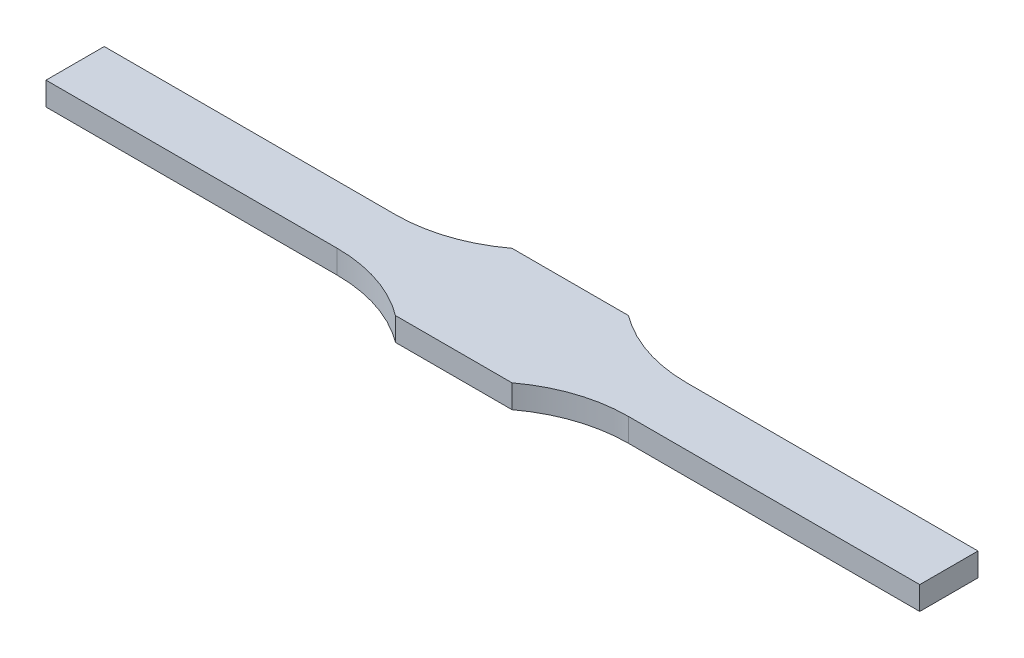
ISO-10303-21;
HEADER;
FILE_DESCRIPTION(('STEP AP214'),'2;1');
FILE_NAME('part.step','',(''),(''),'','','');
FILE_SCHEMA(('AUTOMOTIVE_DESIGN { 1 0 10303 214 1 1 1 1 }'));
ENDSEC;
DATA;
#1=APPLICATION_CONTEXT('core data for automotive mechanical design processes');
#2=APPLICATION_PROTOCOL_DEFINITION('international standard','automotive_design',2000,#1);
#3=PRODUCT_CONTEXT('',#1,'mechanical');
#4=PRODUCT('Part','Part','',(#3));
#5=PRODUCT_RELATED_PRODUCT_CATEGORY('part','',(#4));
#6=PRODUCT_DEFINITION_FORMATION('','',#4);
#7=PRODUCT_DEFINITION_CONTEXT('part definition',#1,'design');
#8=PRODUCT_DEFINITION('design','',#6,#7);
#9=PRODUCT_DEFINITION_SHAPE('','',#8);
#10=(LENGTH_UNIT() NAMED_UNIT(*) SI_UNIT(.MILLI.,.METRE.));
#11=(NAMED_UNIT(*) PLANE_ANGLE_UNIT() SI_UNIT($,.RADIAN.));
#12=(NAMED_UNIT(*) SI_UNIT($,.STERADIAN.) SOLID_ANGLE_UNIT());
#13=UNCERTAINTY_MEASURE_WITH_UNIT(LENGTH_MEASURE(1.E-05),#10,'distance_accuracy_value','');
#14=(GEOMETRIC_REPRESENTATION_CONTEXT(3) GLOBAL_UNCERTAINTY_ASSIGNED_CONTEXT((#13)) GLOBAL_UNIT_ASSIGNED_CONTEXT((#10,
#11,#12)) REPRESENTATION_CONTEXT('',''));
#15=CARTESIAN_POINT('',(0.,0.,0.));
#16=DIRECTION('',(0.,0.,1.));
#17=DIRECTION('',(1.,0.,0.));
#18=AXIS2_PLACEMENT_3D('',#15,#16,#17);
#19=CARTESIAN_POINT('',(25.,2.,-30.));
#20=DIRECTION('',(0.,-1.,0.));
#21=DIRECTION('',(0.,0.,-1.));
#22=AXIS2_PLACEMENT_3D('',#19,#20,#21);
#23=CYLINDRICAL_SURFACE('',#22,25.0000000000001);
#24=CARTESIAN_POINT('',(25.,-2.,-30.));
#25=DIRECTION('',(0.,-1.,0.));
#26=DIRECTION('',(0.,0.,-1.));
#27=AXIS2_PLACEMENT_3D('',#24,#25,#26);
#28=CIRCLE('',#27,25.0000000000001);
#29=CARTESIAN_POINT('',(25.,-2.,-4.99999999999989));
#30=VERTEX_POINT('',#29);
#31=CARTESIAN_POINT('',(9.99999999999982,-2.,-10.));
#32=VERTEX_POINT('',#31);
#33=EDGE_CURVE('E182',#30,#32,#28,.T.);
#34=ORIENTED_EDGE('',*,*,#33,.T.);
#35=DIRECTION('',(0.,-1.,0.));
#36=VECTOR('',#35,1.);
#37=CARTESIAN_POINT('',(9.99999999999982,2.,-10.));
#38=LINE('',#37,#36);
#39=CARTESIAN_POINT('',(9.99999999999982,2.,-10.));
#40=VERTEX_POINT('',#39);
#41=EDGE_CURVE('E11',#40,#32,#38,.T.);
#42=ORIENTED_EDGE('',*,*,#41,.F.);
#43=CARTESIAN_POINT('',(25.,2.,-30.));
#44=DIRECTION('',(0.,-1.,0.));
#45=DIRECTION('',(0.,0.,-1.));
#46=AXIS2_PLACEMENT_3D('',#43,#44,#45);
#47=CIRCLE('',#46,25.0000000000001);
#48=CARTESIAN_POINT('',(25.,2.,-4.99999999999989));
#49=VERTEX_POINT('',#48);
#50=EDGE_CURVE('E184',#49,#40,#47,.T.);
#51=ORIENTED_EDGE('',*,*,#50,.F.);
#52=DIRECTION('',(0.,-1.,0.));
#53=VECTOR('',#52,1.);
#54=CARTESIAN_POINT('',(25.,2.,-4.99999999999989));
#55=LINE('',#54,#53);
#56=EDGE_CURVE('E195',#49,#30,#55,.T.);
#57=ORIENTED_EDGE('',*,*,#56,.T.);
#58=EDGE_LOOP('',(#34,#42,#51,#57));
#59=FACE_BOUND('',#58,.T.);
#60=ADVANCED_FACE('F39',(#59),#23,.F.);
#61=CARTESIAN_POINT('',(0.,2.,-10.));
#62=DIRECTION('',(0.,0.,1.));
#63=DIRECTION('',(1.,0.,0.));
#64=AXIS2_PLACEMENT_3D('',#61,#62,#63);
#65=PLANE('',#64);
#66=DIRECTION('',(-1.,0.,0.));
#67=VECTOR('',#66,1.);
#68=CARTESIAN_POINT('',(0.,-2.,-10.));
#69=LINE('',#68,#67);
#70=CARTESIAN_POINT('',(-9.99999999999982,-2.00000000000007,-10.));
#71=VERTEX_POINT('',#70);
#72=EDGE_CURVE('E198',#32,#71,#69,.T.);
#73=ORIENTED_EDGE('',*,*,#72,.T.);
#74=DIRECTION('',(0.,-1.,0.));
#75=VECTOR('',#74,1.);
#76=CARTESIAN_POINT('',(-9.99999999999984,1.99999999999993,-10.));
#77=LINE('',#76,#75);
#78=CARTESIAN_POINT('',(-9.99999999999984,1.99999999999993,-10.));
#79=VERTEX_POINT('',#78);
#80=EDGE_CURVE('E164',#79,#71,#77,.T.);
#81=ORIENTED_EDGE('',*,*,#80,.F.);
#82=DIRECTION('',(-1.,0.,0.));
#83=VECTOR('',#82,1.);
#84=CARTESIAN_POINT('',(0.,2.,-10.));
#85=LINE('',#84,#83);
#86=EDGE_CURVE('E91',#40,#79,#85,.T.);
#87=ORIENTED_EDGE('',*,*,#86,.F.);
#88=ORIENTED_EDGE('',*,*,#41,.T.);
#89=EDGE_LOOP('',(#73,#81,#87,#88));
#90=FACE_BOUND('',#89,.T.);
#91=ADVANCED_FACE('F251',(#90),#65,.F.);
#92=CARTESIAN_POINT('',(0.,2.,10.));
#93=DIRECTION('',(0.,0.,-1.));
#94=DIRECTION('',(-1.,0.,0.));
#95=AXIS2_PLACEMENT_3D('',#92,#93,#94);
#96=PLANE('',#95);
#97=DIRECTION('',(1.,0.,0.));
#98=VECTOR('',#97,1.);
#99=CARTESIAN_POINT('',(0.,-2.,10.));
#100=LINE('',#99,#98);
#101=CARTESIAN_POINT('',(-9.99999999999981,-2.00000000000007,10.));
#102=VERTEX_POINT('',#101);
#103=CARTESIAN_POINT('',(9.99999999999983,-2.,10.));
#104=VERTEX_POINT('',#103);
#105=EDGE_CURVE('E200',#102,#104,#100,.T.);
#106=ORIENTED_EDGE('',*,*,#105,.T.);
#107=DIRECTION('',(0.,-1.,0.));
#108=VECTOR('',#107,1.);
#109=CARTESIAN_POINT('',(9.99999999999983,2.,10.));
#110=LINE('',#109,#108);
#111=CARTESIAN_POINT('',(9.99999999999983,2.,10.));
#112=VERTEX_POINT('',#111);
#113=EDGE_CURVE('E46',#112,#104,#110,.T.);
#114=ORIENTED_EDGE('',*,*,#113,.F.);
#115=DIRECTION('',(1.,0.,0.));
#116=VECTOR('',#115,1.);
#117=CARTESIAN_POINT('',(0.,2.,10.));
#118=LINE('',#117,#116);
#119=CARTESIAN_POINT('',(-9.99999999999984,1.99999999999993,10.));
#120=VERTEX_POINT('',#119);
#121=EDGE_CURVE('E187',#120,#112,#118,.T.);
#122=ORIENTED_EDGE('',*,*,#121,.F.);
#123=DIRECTION('',(0.,-1.,0.));
#124=VECTOR('',#123,1.);
#125=CARTESIAN_POINT('',(-9.99999999999984,1.99999999999993,10.));
#126=LINE('',#125,#124);
#127=EDGE_CURVE('E173',#120,#102,#126,.T.);
#128=ORIENTED_EDGE('',*,*,#127,.T.);
#129=EDGE_LOOP('',(#106,#114,#122,#128));
#130=FACE_BOUND('',#129,.T.);
#131=ADVANCED_FACE('F228',(#130),#96,.F.);
#132=CARTESIAN_POINT('',(25.,2.,30.));
#133=DIRECTION('',(0.,-1.,0.));
#134=DIRECTION('',(0.,0.,-1.));
#135=AXIS2_PLACEMENT_3D('',#132,#133,#134);
#136=CYLINDRICAL_SURFACE('',#135,25.0000000000001);
#137=CARTESIAN_POINT('',(25.,-2.,30.));
#138=DIRECTION('',(0.,-1.,0.));
#139=DIRECTION('',(0.,0.,1.));
#140=AXIS2_PLACEMENT_3D('',#137,#138,#139);
#141=CIRCLE('',#140,25.0000000000001);
#142=CARTESIAN_POINT('',(25.,-2.,4.99999999999989));
#143=VERTEX_POINT('',#142);
#144=EDGE_CURVE('E202',#104,#143,#141,.T.);
#145=ORIENTED_EDGE('',*,*,#144,.T.);
#146=DIRECTION('',(0.,-1.,0.));
#147=VECTOR('',#146,1.);
#148=CARTESIAN_POINT('',(25.,2.,4.99999999999989));
#149=LINE('',#148,#147);
#150=CARTESIAN_POINT('',(25.,2.,4.99999999999989));
#151=VERTEX_POINT('',#150);
#152=EDGE_CURVE('E209',#151,#143,#149,.T.);
#153=ORIENTED_EDGE('',*,*,#152,.F.);
#154=CARTESIAN_POINT('',(25.,2.,30.));
#155=DIRECTION('',(0.,-1.,0.));
#156=DIRECTION('',(0.,0.,1.));
#157=AXIS2_PLACEMENT_3D('',#154,#155,#156);
#158=CIRCLE('',#157,25.0000000000001);
#159=EDGE_CURVE('E189',#112,#151,#158,.T.);
#160=ORIENTED_EDGE('',*,*,#159,.F.);
#161=ORIENTED_EDGE('',*,*,#113,.T.);
#162=EDGE_LOOP('',(#145,#153,#160,#161));
#163=FACE_BOUND('',#162,.T.);
#164=ADVANCED_FACE('F216',(#163),#136,.F.);
#165=CARTESIAN_POINT('',(25.,2.,4.99999999999989));
#166=DIRECTION('',(0.,0.,-1.));
#167=DIRECTION('',(-1.,0.,0.));
#168=AXIS2_PLACEMENT_3D('',#165,#166,#167);
#169=PLANE('',#168);
#170=DIRECTION('',(1.,0.,0.));
#171=VECTOR('',#170,1.);
#172=CARTESIAN_POINT('',(25.,-2.,4.99999999999989));
#173=LINE('',#172,#171);
#174=CARTESIAN_POINT('',(75.,-2.,4.99999999999989));
#175=VERTEX_POINT('',#174);
#176=EDGE_CURVE('E204',#143,#175,#173,.T.);
#177=ORIENTED_EDGE('',*,*,#176,.T.);
#178=DIRECTION('',(0.,1.,0.));
#179=VECTOR('',#178,1.);
#180=CARTESIAN_POINT('',(75.,-2.,4.99999999999989));
#181=LINE('',#180,#179);
#182=CARTESIAN_POINT('',(75.,2.,4.99999999999989));
#183=VERTEX_POINT('',#182);
#184=EDGE_CURVE('E53',#175,#183,#181,.T.);
#185=ORIENTED_EDGE('',*,*,#184,.T.);
#186=DIRECTION('',(1.,0.,0.));
#187=VECTOR('',#186,1.);
#188=CARTESIAN_POINT('',(25.,2.,4.99999999999989));
#189=LINE('',#188,#187);
#190=EDGE_CURVE('E191',#151,#183,#189,.T.);
#191=ORIENTED_EDGE('',*,*,#190,.F.);
#192=ORIENTED_EDGE('',*,*,#152,.T.);
#193=EDGE_LOOP('',(#177,#185,#191,#192));
#194=FACE_BOUND('',#193,.T.);
#195=ADVANCED_FACE('F222',(#194),#169,.F.);
#196=CARTESIAN_POINT('',(25.,2.,-4.99999999999989));
#197=DIRECTION('',(0.,0.,1.));
#198=DIRECTION('',(1.,0.,0.));
#199=AXIS2_PLACEMENT_3D('',#196,#197,#198);
#200=PLANE('',#199);
#201=DIRECTION('',(-1.,0.,0.));
#202=VECTOR('',#201,1.);
#203=CARTESIAN_POINT('',(25.,2.,-4.99999999999989));
#204=LINE('',#203,#202);
#205=CARTESIAN_POINT('',(75.,2.,-4.99999999999989));
#206=VERTEX_POINT('',#205);
#207=EDGE_CURVE('E62',#206,#49,#204,.T.);
#208=ORIENTED_EDGE('',*,*,#207,.F.);
#209=DIRECTION('',(0.,1.,0.));
#210=VECTOR('',#209,1.);
#211=CARTESIAN_POINT('',(75.,-2.,-4.99999999999989));
#212=LINE('',#211,#210);
#213=CARTESIAN_POINT('',(75.,-2.,-4.99999999999989));
#214=VERTEX_POINT('',#213);
#215=EDGE_CURVE('E180',#214,#206,#212,.T.);
#216=ORIENTED_EDGE('',*,*,#215,.F.);
#217=DIRECTION('',(-1.,0.,0.));
#218=VECTOR('',#217,1.);
#219=CARTESIAN_POINT('',(25.,-2.,-4.99999999999989));
#220=LINE('',#219,#218);
#221=EDGE_CURVE('E84',#214,#30,#220,.T.);
#222=ORIENTED_EDGE('',*,*,#221,.T.);
#223=ORIENTED_EDGE('',*,*,#56,.F.);
#224=EDGE_LOOP('',(#208,#216,#222,#223));
#225=FACE_BOUND('',#224,.T.);
#226=ADVANCED_FACE('F254',(#225),#200,.F.);
#227=CARTESIAN_POINT('',(25.,2.,-30.));
#228=DIRECTION('',(0.,-1.,0.));
#229=DIRECTION('',(0.,0.,-1.));
#230=AXIS2_PLACEMENT_3D('',#227,#228,#229);
#231=PLANE('',#230);
#232=ORIENTED_EDGE('',*,*,#190,.T.);
#233=DIRECTION('',(0.,0.,1.));
#234=VECTOR('',#233,1.);
#235=CARTESIAN_POINT('',(75.,2.,0.));
#236=LINE('',#235,#234);
#237=EDGE_CURVE('E176',#206,#183,#236,.T.);
#238=ORIENTED_EDGE('',*,*,#237,.F.);
#239=ORIENTED_EDGE('',*,*,#207,.T.);
#240=ORIENTED_EDGE('',*,*,#50,.T.);
#241=ORIENTED_EDGE('',*,*,#86,.T.);
#242=CARTESIAN_POINT('',(-25.,1.99999999999983,-30.));
#243=DIRECTION('',(0.,-1.,0.));
#244=DIRECTION('',(0.,0.,-1.));
#245=AXIS2_PLACEMENT_3D('',#242,#243,#244);
#246=CIRCLE('',#245,25.0000000000001);
#247=CARTESIAN_POINT('',(-25.,1.99999999999983,-4.99999999999989));
#248=VERTEX_POINT('',#247);
#249=EDGE_CURVE('E162',#79,#248,#246,.T.);
#250=ORIENTED_EDGE('',*,*,#249,.T.);
#251=DIRECTION('',(-1.,0.,0.));
#252=VECTOR('',#251,1.);
#253=CARTESIAN_POINT('',(-25.,1.99999999999983,-4.99999999999989));
#254=LINE('',#253,#252);
#255=CARTESIAN_POINT('',(-75.,1.99999999999949,-4.99999999999989));
#256=VERTEX_POINT('',#255);
#257=EDGE_CURVE('E244',#248,#256,#254,.T.);
#258=ORIENTED_EDGE('',*,*,#257,.T.);
#259=DIRECTION('',(0.,0.,-1.));
#260=VECTOR('',#259,1.);
#261=CARTESIAN_POINT('',(-75.,1.99999999999949,0.));
#262=LINE('',#261,#260);
#263=CARTESIAN_POINT('',(-75.,1.99999999999949,4.99999999999989));
#264=VERTEX_POINT('',#263);
#265=EDGE_CURVE('E161',#264,#256,#262,.T.);
#266=ORIENTED_EDGE('',*,*,#265,.F.);
#267=DIRECTION('',(1.,0.,0.));
#268=VECTOR('',#267,1.);
#269=CARTESIAN_POINT('',(-25.,1.99999999999983,4.99999999999989));
#270=LINE('',#269,#268);
#271=CARTESIAN_POINT('',(-25.,1.99999999999983,4.99999999999989));
#272=VERTEX_POINT('',#271);
#273=EDGE_CURVE('E236',#264,#272,#270,.T.);
#274=ORIENTED_EDGE('',*,*,#273,.T.);
#275=CARTESIAN_POINT('',(-25.,1.99999999999983,30.));
#276=DIRECTION('',(0.,-1.,0.));
#277=DIRECTION('',(0.,0.,1.));
#278=AXIS2_PLACEMENT_3D('',#275,#276,#277);
#279=CIRCLE('',#278,25.0000000000001);
#280=EDGE_CURVE('E167',#272,#120,#279,.T.);
#281=ORIENTED_EDGE('',*,*,#280,.T.);
#282=ORIENTED_EDGE('',*,*,#121,.T.);
#283=ORIENTED_EDGE('',*,*,#159,.T.);
#284=EDGE_LOOP('',(#232,#238,#239,#240,#241,#250,#258,#266,#274,#281,#282,#283));
#285=FACE_BOUND('',#284,.T.);
#286=ADVANCED_FACE('F224',(#285),#231,.F.);
#287=CARTESIAN_POINT('',(25.,-2.,-30.));
#288=DIRECTION('',(0.,-1.,0.));
#289=DIRECTION('',(0.,0.,-1.));
#290=AXIS2_PLACEMENT_3D('',#287,#288,#289);
#291=PLANE('',#290);
#292=DIRECTION('',(0.,0.,1.));
#293=VECTOR('',#292,1.);
#294=CARTESIAN_POINT('',(75.,-2.,0.));
#295=LINE('',#294,#293);
#296=EDGE_CURVE('E178',#214,#175,#295,.T.);
#297=ORIENTED_EDGE('',*,*,#296,.T.);
#298=ORIENTED_EDGE('',*,*,#176,.F.);
#299=ORIENTED_EDGE('',*,*,#144,.F.);
#300=ORIENTED_EDGE('',*,*,#105,.F.);
#301=CARTESIAN_POINT('',(-25.,-2.00000000000017,30.));
#302=DIRECTION('',(0.,-1.,0.));
#303=DIRECTION('',(0.,0.,1.));
#304=AXIS2_PLACEMENT_3D('',#301,#302,#303);
#305=CIRCLE('',#304,25.0000000000001);
#306=CARTESIAN_POINT('',(-25.,-2.00000000000017,4.99999999999989));
#307=VERTEX_POINT('',#306);
#308=EDGE_CURVE('E232',#307,#102,#305,.T.);
#309=ORIENTED_EDGE('',*,*,#308,.F.);
#310=DIRECTION('',(1.,0.,0.));
#311=VECTOR('',#310,1.);
#312=CARTESIAN_POINT('',(-25.,-2.00000000000017,4.99999999999989));
#313=LINE('',#312,#311);
#314=CARTESIAN_POINT('',(-75.,-2.00000000000051,4.99999999999989));
#315=VERTEX_POINT('',#314);
#316=EDGE_CURVE('E143',#315,#307,#313,.T.);
#317=ORIENTED_EDGE('',*,*,#316,.F.);
#318=DIRECTION('',(0.,0.,-1.));
#319=VECTOR('',#318,1.);
#320=CARTESIAN_POINT('',(-75.,-2.00000000000051,0.));
#321=LINE('',#320,#319);
#322=CARTESIAN_POINT('',(-75.,-2.00000000000051,-4.99999999999989));
#323=VERTEX_POINT('',#322);
#324=EDGE_CURVE('E136',#315,#323,#321,.T.);
#325=ORIENTED_EDGE('',*,*,#324,.T.);
#326=DIRECTION('',(-1.,0.,0.));
#327=VECTOR('',#326,1.);
#328=CARTESIAN_POINT('',(-25.,-2.00000000000017,-4.99999999999989));
#329=LINE('',#328,#327);
#330=CARTESIAN_POINT('',(-25.,-2.00000000000017,-4.99999999999989));
#331=VERTEX_POINT('',#330);
#332=EDGE_CURVE('E140',#331,#323,#329,.T.);
#333=ORIENTED_EDGE('',*,*,#332,.F.);
#334=CARTESIAN_POINT('',(-25.,-2.00000000000017,-30.));
#335=DIRECTION('',(0.,-1.,0.));
#336=DIRECTION('',(0.,0.,-1.));
#337=AXIS2_PLACEMENT_3D('',#334,#335,#336);
#338=CIRCLE('',#337,25.0000000000001);
#339=EDGE_CURVE('E156',#71,#331,#338,.T.);
#340=ORIENTED_EDGE('',*,*,#339,.F.);
#341=ORIENTED_EDGE('',*,*,#72,.F.);
#342=ORIENTED_EDGE('',*,*,#33,.F.);
#343=ORIENTED_EDGE('',*,*,#221,.F.);
#344=EDGE_LOOP('',(#297,#298,#299,#300,#309,#317,#325,#333,#340,#341,#342,#343));
#345=FACE_BOUND('',#344,.T.);
#346=ADVANCED_FACE('F138',(#345),#291,.T.);
#347=CARTESIAN_POINT('',(75.,-2.,0.));
#348=DIRECTION('',(-1.,0.,0.));
#349=DIRECTION('',(0.,0.,1.));
#350=AXIS2_PLACEMENT_3D('',#347,#348,#349);
#351=PLANE('',#350);
#352=ORIENTED_EDGE('',*,*,#184,.F.);
#353=ORIENTED_EDGE('',*,*,#296,.F.);
#354=ORIENTED_EDGE('',*,*,#215,.T.);
#355=ORIENTED_EDGE('',*,*,#237,.T.);
#356=EDGE_LOOP('',(#352,#353,#354,#355));
#357=FACE_BOUND('',#356,.T.);
#358=ADVANCED_FACE('F255',(#357),#351,.F.);
#359=CARTESIAN_POINT('',(-75.,-5.14537349832865E-13,0.));
#360=DIRECTION('',(-1.,0.,0.));
#361=DIRECTION('',(0.,0.,1.));
#362=AXIS2_PLACEMENT_3D('',#359,#360,#361);
#363=PLANE('',#362);
#364=DIRECTION('',(0.,1.,0.));
#365=VECTOR('',#364,1.);
#366=CARTESIAN_POINT('',(-75.,-2.00000000000051,-4.99999999999989));
#367=LINE('',#366,#365);
#368=EDGE_CURVE('E153',#323,#256,#367,.T.);
#369=ORIENTED_EDGE('',*,*,#368,.F.);
#370=ORIENTED_EDGE('',*,*,#324,.F.);
#371=DIRECTION('',(0.,1.,0.));
#372=VECTOR('',#371,1.);
#373=CARTESIAN_POINT('',(-75.,-2.00000000000051,4.99999999999989));
#374=LINE('',#373,#372);
#375=EDGE_CURVE('E241',#315,#264,#374,.T.);
#376=ORIENTED_EDGE('',*,*,#375,.T.);
#377=ORIENTED_EDGE('',*,*,#265,.T.);
#378=EDGE_LOOP('',(#369,#370,#376,#377));
#379=FACE_BOUND('',#378,.T.);
#380=ADVANCED_FACE('F159',(#379),#363,.T.);
#381=CARTESIAN_POINT('',(-25.,1.99999999999983,30.));
#382=DIRECTION('',(0.,-1.,0.));
#383=DIRECTION('',(0.,0.,1.));
#384=AXIS2_PLACEMENT_3D('',#381,#382,#383);
#385=CYLINDRICAL_SURFACE('',#384,25.0000000000001);
#386=ORIENTED_EDGE('',*,*,#308,.T.);
#387=ORIENTED_EDGE('',*,*,#127,.F.);
#388=ORIENTED_EDGE('',*,*,#280,.F.);
#389=DIRECTION('',(0.,-1.,0.));
#390=VECTOR('',#389,1.);
#391=CARTESIAN_POINT('',(-25.,1.99999999999983,4.99999999999989));
#392=LINE('',#391,#390);
#393=EDGE_CURVE('E234',#272,#307,#392,.T.);
#394=ORIENTED_EDGE('',*,*,#393,.T.);
#395=EDGE_LOOP('',(#386,#387,#388,#394));
#396=FACE_BOUND('',#395,.T.);
#397=ADVANCED_FACE('F230',(#396),#385,.F.);
#398=CARTESIAN_POINT('',(-25.,1.99999999999983,-30.));
#399=DIRECTION('',(0.,-1.,0.));
#400=DIRECTION('',(0.,0.,1.));
#401=AXIS2_PLACEMENT_3D('',#398,#399,#400);
#402=CYLINDRICAL_SURFACE('',#401,25.0000000000001);
#403=ORIENTED_EDGE('',*,*,#339,.T.);
#404=DIRECTION('',(0.,-1.,0.));
#405=VECTOR('',#404,1.);
#406=CARTESIAN_POINT('',(-25.,1.99999999999983,-4.99999999999989));
#407=LINE('',#406,#405);
#408=EDGE_CURVE('E155',#248,#331,#407,.T.);
#409=ORIENTED_EDGE('',*,*,#408,.F.);
#410=ORIENTED_EDGE('',*,*,#249,.F.);
#411=ORIENTED_EDGE('',*,*,#80,.T.);
#412=EDGE_LOOP('',(#403,#409,#410,#411));
#413=FACE_BOUND('',#412,.T.);
#414=ADVANCED_FACE('F248',(#413),#402,.F.);
#415=CARTESIAN_POINT('',(-25.,1.99999999999983,-4.99999999999989));
#416=DIRECTION('',(0.,0.,1.));
#417=DIRECTION('',(1.,0.,0.));
#418=AXIS2_PLACEMENT_3D('',#415,#416,#417);
#419=PLANE('',#418);
#420=ORIENTED_EDGE('',*,*,#332,.T.);
#421=ORIENTED_EDGE('',*,*,#368,.T.);
#422=ORIENTED_EDGE('',*,*,#257,.F.);
#423=ORIENTED_EDGE('',*,*,#408,.T.);
#424=EDGE_LOOP('',(#420,#421,#422,#423));
#425=FACE_BOUND('',#424,.T.);
#426=ADVANCED_FACE('F152',(#425),#419,.F.);
#427=CARTESIAN_POINT('',(-25.,1.99999999999983,4.99999999999989));
#428=DIRECTION('',(0.,0.,-1.));
#429=DIRECTION('',(-1.,0.,0.));
#430=AXIS2_PLACEMENT_3D('',#427,#428,#429);
#431=PLANE('',#430);
#432=ORIENTED_EDGE('',*,*,#273,.F.);
#433=ORIENTED_EDGE('',*,*,#375,.F.);
#434=ORIENTED_EDGE('',*,*,#316,.T.);
#435=ORIENTED_EDGE('',*,*,#393,.F.);
#436=EDGE_LOOP('',(#432,#433,#434,#435));
#437=FACE_BOUND('',#436,.T.);
#438=ADVANCED_FACE('F316',(#437),#431,.F.);
#439=CLOSED_SHELL('',(#60,#91,#131,#164,#195,#226,#286,#346,#358,#380,#397,#414,#426,#438));
#440=MANIFOLD_SOLID_BREP('B2',#439);
#441=ADVANCED_BREP_SHAPE_REPRESENTATION('',(#18,#440),#14);
#442=SHAPE_DEFINITION_REPRESENTATION(#9,#441);
ENDSEC;
END-ISO-10303-21;
